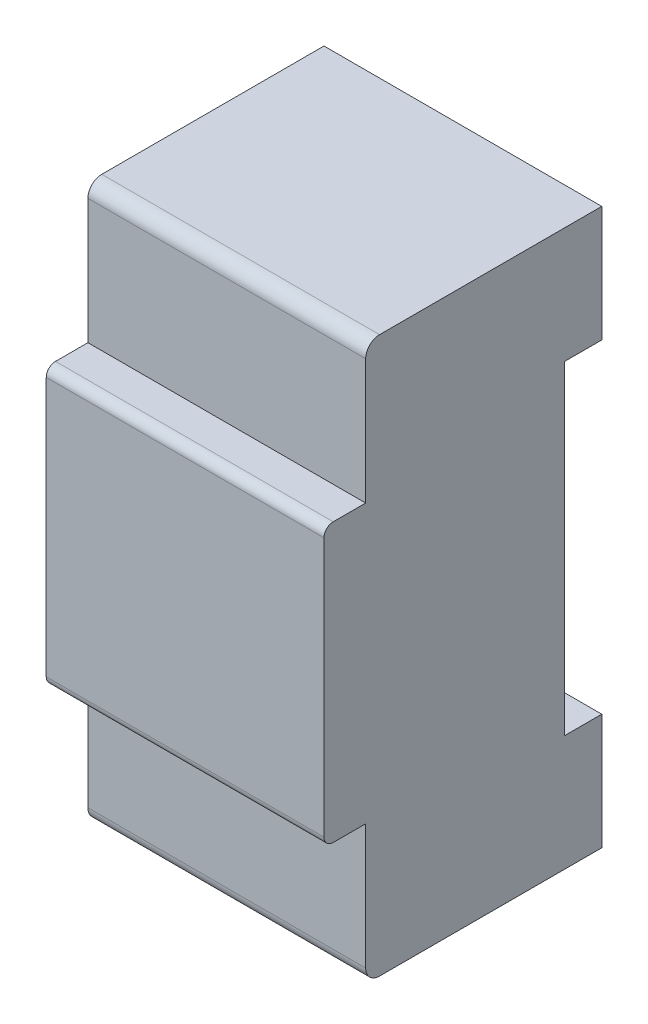
ISO-10303-21;
HEADER;
FILE_DESCRIPTION(('STEP AP214'),'2;1');
FILE_NAME('part.step','',(''),(''),'','','');
FILE_SCHEMA(('AUTOMOTIVE_DESIGN { 1 0 10303 214 1 1 1 1 }'));
ENDSEC;
DATA;
#1=APPLICATION_CONTEXT('core data for automotive mechanical design processes');
#2=APPLICATION_PROTOCOL_DEFINITION('international standard','automotive_design',2000,#1);
#3=PRODUCT_CONTEXT('',#1,'mechanical');
#4=PRODUCT('Part','Part','',(#3));
#5=PRODUCT_RELATED_PRODUCT_CATEGORY('part','',(#4));
#6=PRODUCT_DEFINITION_FORMATION('','',#4);
#7=PRODUCT_DEFINITION_CONTEXT('part definition',#1,'design');
#8=PRODUCT_DEFINITION('design','',#6,#7);
#9=PRODUCT_DEFINITION_SHAPE('','',#8);
#10=(LENGTH_UNIT() NAMED_UNIT(*) SI_UNIT(.MILLI.,.METRE.));
#11=(NAMED_UNIT(*) PLANE_ANGLE_UNIT() SI_UNIT($,.RADIAN.));
#12=(NAMED_UNIT(*) SI_UNIT($,.STERADIAN.) SOLID_ANGLE_UNIT());
#13=UNCERTAINTY_MEASURE_WITH_UNIT(LENGTH_MEASURE(1.E-05),#10,'distance_accuracy_value','');
#14=(GEOMETRIC_REPRESENTATION_CONTEXT(3) GLOBAL_UNCERTAINTY_ASSIGNED_CONTEXT((#13)) GLOBAL_UNIT_ASSIGNED_CONTEXT((#10,
#11,#12)) REPRESENTATION_CONTEXT('',''));
#15=CARTESIAN_POINT('',(0.,0.,0.));
#16=DIRECTION('',(0.,0.,1.));
#17=DIRECTION('',(1.,0.,0.));
#18=AXIS2_PLACEMENT_3D('',#15,#16,#17);
#19=CARTESIAN_POINT('',(30.,-35.,0.));
#20=DIRECTION('',(0.,0.,1.));
#21=DIRECTION('',(1.,0.,0.));
#22=AXIS2_PLACEMENT_3D('',#19,#20,#21);
#23=PLANE('',#22);
#24=DIRECTION('',(0.,1.,0.));
#25=VECTOR('',#24,1.);
#26=CARTESIAN_POINT('',(0.,-35.,0.));
#27=LINE('',#26,#25);
#28=CARTESIAN_POINT('',(0.,-35.,0.));
#29=VERTEX_POINT('',#28);
#30=CARTESIAN_POINT('',(0.,0.,0.));
#31=VERTEX_POINT('',#30);
#32=EDGE_CURVE('E168',#29,#31,#27,.T.);
#33=ORIENTED_EDGE('',*,*,#32,.T.);
#34=DIRECTION('',(-1.,0.,0.));
#35=VECTOR('',#34,1.);
#36=CARTESIAN_POINT('',(30.,0.,0.));
#37=LINE('',#36,#35);
#38=CARTESIAN_POINT('',(30.,0.,0.));
#39=VERTEX_POINT('',#38);
#40=EDGE_CURVE('E149',#39,#31,#37,.T.);
#41=ORIENTED_EDGE('',*,*,#40,.F.);
#42=DIRECTION('',(0.,1.,0.));
#43=VECTOR('',#42,1.);
#44=CARTESIAN_POINT('',(30.,-35.,0.));
#45=LINE('',#44,#43);
#46=CARTESIAN_POINT('',(30.,-35.,0.));
#47=VERTEX_POINT('',#46);
#48=EDGE_CURVE('E156',#47,#39,#45,.T.);
#49=ORIENTED_EDGE('',*,*,#48,.F.);
#50=DIRECTION('',(-1.,0.,0.));
#51=VECTOR('',#50,1.);
#52=CARTESIAN_POINT('',(30.,-35.,0.));
#53=LINE('',#52,#51);
#54=EDGE_CURVE('E244',#47,#29,#53,.T.);
#55=ORIENTED_EDGE('',*,*,#54,.T.);
#56=EDGE_LOOP('',(#33,#41,#49,#55));
#57=FACE_BOUND('',#56,.T.);
#58=ADVANCED_FACE('F30',(#57),#23,.F.);
#59=CARTESIAN_POINT('',(30.,0.,0.));
#60=DIRECTION('',(0.,1.,0.));
#61=DIRECTION('',(0.,0.,1.));
#62=AXIS2_PLACEMENT_3D('',#59,#60,#61);
#63=PLANE('',#62);
#64=DIRECTION('',(0.,0.,-1.));
#65=VECTOR('',#64,1.);
#66=CARTESIAN_POINT('',(0.,0.,0.));
#67=LINE('',#66,#65);
#68=CARTESIAN_POINT('',(0.,0.,-4.));
#69=VERTEX_POINT('',#68);
#70=EDGE_CURVE('E271',#31,#69,#67,.T.);
#71=ORIENTED_EDGE('',*,*,#70,.T.);
#72=DIRECTION('',(-1.,0.,0.));
#73=VECTOR('',#72,1.);
#74=CARTESIAN_POINT('',(30.,0.,-4.));
#75=LINE('',#74,#73);
#76=CARTESIAN_POINT('',(30.,0.,-4.));
#77=VERTEX_POINT('',#76);
#78=EDGE_CURVE('E152',#77,#69,#75,.T.);
#79=ORIENTED_EDGE('',*,*,#78,.F.);
#80=DIRECTION('',(0.,0.,-1.));
#81=VECTOR('',#80,1.);
#82=CARTESIAN_POINT('',(30.,0.,0.));
#83=LINE('',#82,#81);
#84=EDGE_CURVE('E145',#39,#77,#83,.T.);
#85=ORIENTED_EDGE('',*,*,#84,.F.);
#86=ORIENTED_EDGE('',*,*,#40,.T.);
#87=EDGE_LOOP('',(#71,#79,#85,#86));
#88=FACE_BOUND('',#87,.T.);
#89=ADVANCED_FACE('F147',(#88),#63,.F.);
#90=CARTESIAN_POINT('',(30.,0.,-4.));
#91=DIRECTION('',(0.,0.,1.));
#92=DIRECTION('',(1.,0.,0.));
#93=AXIS2_PLACEMENT_3D('',#90,#91,#92);
#94=PLANE('',#93);
#95=DIRECTION('',(0.,1.,0.));
#96=VECTOR('',#95,1.);
#97=CARTESIAN_POINT('',(0.,0.,-4.));
#98=LINE('',#97,#96);
#99=CARTESIAN_POINT('',(0.,12.5,-4.));
#100=VERTEX_POINT('',#99);
#101=EDGE_CURVE('E268',#69,#100,#98,.T.);
#102=ORIENTED_EDGE('',*,*,#101,.T.);
#103=DIRECTION('',(-1.,0.,0.));
#104=VECTOR('',#103,1.);
#105=CARTESIAN_POINT('',(30.,12.5,-4.));
#106=LINE('',#105,#104);
#107=CARTESIAN_POINT('',(30.,12.5,-4.));
#108=VERTEX_POINT('',#107);
#109=EDGE_CURVE('E174',#108,#100,#106,.T.);
#110=ORIENTED_EDGE('',*,*,#109,.F.);
#111=DIRECTION('',(0.,1.,0.));
#112=VECTOR('',#111,1.);
#113=CARTESIAN_POINT('',(30.,0.,-4.));
#114=LINE('',#113,#112);
#115=EDGE_CURVE('E155',#77,#108,#114,.T.);
#116=ORIENTED_EDGE('',*,*,#115,.F.);
#117=ORIENTED_EDGE('',*,*,#78,.T.);
#118=EDGE_LOOP('',(#102,#110,#116,#117));
#119=FACE_BOUND('',#118,.T.);
#120=ADVANCED_FACE('F289',(#119),#94,.F.);
#121=CARTESIAN_POINT('',(30.,12.5,-4.));
#122=DIRECTION('',(0.,-1.,0.));
#123=DIRECTION('',(0.,0.,-1.));
#124=AXIS2_PLACEMENT_3D('',#121,#122,#123);
#125=PLANE('',#124);
#126=DIRECTION('',(0.,0.,1.));
#127=VECTOR('',#126,1.);
#128=CARTESIAN_POINT('',(0.,12.5,-4.));
#129=LINE('',#128,#127);
#130=CARTESIAN_POINT('',(0.,12.5,20.));
#131=VERTEX_POINT('',#130);
#132=EDGE_CURVE('E262',#100,#131,#129,.T.);
#133=ORIENTED_EDGE('',*,*,#132,.T.);
#134=DIRECTION('',(-1.,0.,0.));
#135=VECTOR('',#134,1.);
#136=CARTESIAN_POINT('',(30.,12.5,20.));
#137=LINE('',#136,#135);
#138=CARTESIAN_POINT('',(30.,12.5,20.));
#139=VERTEX_POINT('',#138);
#140=EDGE_CURVE('E190',#131,#139,#137,.F.);
#141=ORIENTED_EDGE('',*,*,#140,.T.);
#142=DIRECTION('',(0.,0.,1.));
#143=VECTOR('',#142,1.);
#144=CARTESIAN_POINT('',(30.,12.5,-4.));
#145=LINE('',#144,#143);
#146=EDGE_CURVE('E265',#108,#139,#145,.T.);
#147=ORIENTED_EDGE('',*,*,#146,.F.);
#148=ORIENTED_EDGE('',*,*,#109,.T.);
#149=EDGE_LOOP('',(#133,#141,#147,#148));
#150=FACE_BOUND('',#149,.T.);
#151=ADVANCED_FACE('F261',(#150),#125,.F.);
#152=CARTESIAN_POINT('',(30.,12.5,21.5));
#153=DIRECTION('',(0.,0.,-1.));
#154=DIRECTION('',(-1.,0.,0.));
#155=AXIS2_PLACEMENT_3D('',#152,#153,#154);
#156=PLANE('',#155);
#157=DIRECTION('',(0.,-1.,0.));
#158=VECTOR('',#157,1.);
#159=CARTESIAN_POINT('',(30.,12.5,21.5));
#160=LINE('',#159,#158);
#161=CARTESIAN_POINT('',(30.,11.,21.5));
#162=VERTEX_POINT('',#161);
#163=CARTESIAN_POINT('',(30.,-2.50000000000001,21.5));
#164=VERTEX_POINT('',#163);
#165=EDGE_CURVE('E285',#162,#164,#160,.T.);
#166=ORIENTED_EDGE('',*,*,#165,.F.);
#167=DIRECTION('',(-1.,0.,0.));
#168=VECTOR('',#167,1.);
#169=CARTESIAN_POINT('',(30.,11.,21.5));
#170=LINE('',#169,#168);
#171=CARTESIAN_POINT('',(0.,11.,21.5));
#172=VERTEX_POINT('',#171);
#173=EDGE_CURVE('E187',#162,#172,#170,.T.);
#174=ORIENTED_EDGE('',*,*,#173,.T.);
#175=DIRECTION('',(0.,-1.,0.));
#176=VECTOR('',#175,1.);
#177=CARTESIAN_POINT('',(0.,12.5,21.5));
#178=LINE('',#177,#176);
#179=CARTESIAN_POINT('',(0.,-2.50000000000001,21.5));
#180=VERTEX_POINT('',#179);
#181=EDGE_CURVE('E233',#172,#180,#178,.T.);
#182=ORIENTED_EDGE('',*,*,#181,.T.);
#183=DIRECTION('',(-1.,0.,0.));
#184=VECTOR('',#183,1.);
#185=CARTESIAN_POINT('',(30.,-2.50000000000001,21.5));
#186=LINE('',#185,#184);
#187=EDGE_CURVE('E253',#164,#180,#186,.T.);
#188=ORIENTED_EDGE('',*,*,#187,.F.);
#189=EDGE_LOOP('',(#166,#174,#182,#188));
#190=FACE_BOUND('',#189,.T.);
#191=ADVANCED_FACE('F296',(#190),#156,.F.);
#192=CARTESIAN_POINT('',(30.,-2.50000000000001,21.5));
#193=DIRECTION('',(0.,-1.,0.));
#194=DIRECTION('',(0.,0.,-1.));
#195=AXIS2_PLACEMENT_3D('',#192,#193,#194);
#196=PLANE('',#195);
#197=DIRECTION('',(0.,0.,1.));
#198=VECTOR('',#197,1.);
#199=CARTESIAN_POINT('',(0.,-2.50000000000001,21.5));
#200=LINE('',#199,#198);
#201=CARTESIAN_POINT('',(0.,-2.5,25.));
#202=VERTEX_POINT('',#201);
#203=EDGE_CURVE('E229',#180,#202,#200,.T.);
#204=ORIENTED_EDGE('',*,*,#203,.T.);
#205=DIRECTION('',(-1.,0.,0.));
#206=VECTOR('',#205,1.);
#207=CARTESIAN_POINT('',(30.,-2.5,25.));
#208=LINE('',#207,#206);
#209=CARTESIAN_POINT('',(30.,-2.5,25.));
#210=VERTEX_POINT('',#209);
#211=EDGE_CURVE('E11',#202,#210,#208,.F.);
#212=ORIENTED_EDGE('',*,*,#211,.T.);
#213=DIRECTION('',(0.,0.,1.));
#214=VECTOR('',#213,1.);
#215=CARTESIAN_POINT('',(30.,-2.50000000000001,21.5));
#216=LINE('',#215,#214);
#217=EDGE_CURVE('E283',#164,#210,#216,.T.);
#218=ORIENTED_EDGE('',*,*,#217,.F.);
#219=ORIENTED_EDGE('',*,*,#187,.T.);
#220=EDGE_LOOP('',(#204,#212,#218,#219));
#221=FACE_BOUND('',#220,.T.);
#222=ADVANCED_FACE('F321',(#221),#196,.F.);
#223=CARTESIAN_POINT('',(30.,-2.5,26.));
#224=DIRECTION('',(0.,0.,-1.));
#225=DIRECTION('',(-1.,0.,0.));
#226=AXIS2_PLACEMENT_3D('',#223,#224,#225);
#227=PLANE('',#226);
#228=DIRECTION('',(0.,-1.,0.));
#229=VECTOR('',#228,1.);
#230=CARTESIAN_POINT('',(0.,-2.5,26.));
#231=LINE('',#230,#229);
#232=CARTESIAN_POINT('',(0.,-3.5,26.));
#233=VERTEX_POINT('',#232);
#234=CARTESIAN_POINT('',(0.,-31.5,26.));
#235=VERTEX_POINT('',#234);
#236=EDGE_CURVE('E224',#233,#235,#231,.T.);
#237=ORIENTED_EDGE('',*,*,#236,.T.);
#238=DIRECTION('',(-1.,0.,0.));
#239=VECTOR('',#238,1.);
#240=CARTESIAN_POINT('',(30.,-31.5,26.));
#241=LINE('',#240,#239);
#242=CARTESIAN_POINT('',(30.,-31.5,26.));
#243=VERTEX_POINT('',#242);
#244=EDGE_CURVE('E51',#235,#243,#241,.F.);
#245=ORIENTED_EDGE('',*,*,#244,.T.);
#246=DIRECTION('',(0.,-1.,0.));
#247=VECTOR('',#246,1.);
#248=CARTESIAN_POINT('',(30.,-2.5,26.));
#249=LINE('',#248,#247);
#250=CARTESIAN_POINT('',(30.,-3.5,26.));
#251=VERTEX_POINT('',#250);
#252=EDGE_CURVE('E209',#251,#243,#249,.T.);
#253=ORIENTED_EDGE('',*,*,#252,.F.);
#254=DIRECTION('',(-1.,0.,0.));
#255=VECTOR('',#254,1.);
#256=CARTESIAN_POINT('',(30.,-3.5,26.));
#257=LINE('',#256,#255);
#258=EDGE_CURVE('E199',#251,#233,#257,.T.);
#259=ORIENTED_EDGE('',*,*,#258,.T.);
#260=EDGE_LOOP('',(#237,#245,#253,#259));
#261=FACE_BOUND('',#260,.T.);
#262=ADVANCED_FACE('F227',(#261),#227,.F.);
#263=CARTESIAN_POINT('',(30.,-32.5,26.));
#264=DIRECTION('',(0.,1.,0.));
#265=DIRECTION('',(0.,0.,1.));
#266=AXIS2_PLACEMENT_3D('',#263,#264,#265);
#267=PLANE('',#266);
#268=DIRECTION('',(0.,0.,-1.));
#269=VECTOR('',#268,1.);
#270=CARTESIAN_POINT('',(30.,-32.5,26.));
#271=LINE('',#270,#269);
#272=CARTESIAN_POINT('',(30.,-32.5,25.));
#273=VERTEX_POINT('',#272);
#274=CARTESIAN_POINT('',(30.,-32.5,21.5));
#275=VERTEX_POINT('',#274);
#276=EDGE_CURVE('E207',#273,#275,#271,.T.);
#277=ORIENTED_EDGE('',*,*,#276,.F.);
#278=DIRECTION('',(-1.,0.,0.));
#279=VECTOR('',#278,1.);
#280=CARTESIAN_POINT('',(30.,-32.5,25.));
#281=LINE('',#280,#279);
#282=CARTESIAN_POINT('',(0.,-32.5,25.));
#283=VERTEX_POINT('',#282);
#284=EDGE_CURVE('E192',#273,#283,#281,.T.);
#285=ORIENTED_EDGE('',*,*,#284,.T.);
#286=DIRECTION('',(0.,0.,-1.));
#287=VECTOR('',#286,1.);
#288=CARTESIAN_POINT('',(0.,-32.5,26.));
#289=LINE('',#288,#287);
#290=CARTESIAN_POINT('',(0.,-32.5,21.5));
#291=VERTEX_POINT('',#290);
#292=EDGE_CURVE('E226',#283,#291,#289,.T.);
#293=ORIENTED_EDGE('',*,*,#292,.T.);
#294=DIRECTION('',(-1.,0.,0.));
#295=VECTOR('',#294,1.);
#296=CARTESIAN_POINT('',(30.,-32.5,21.5));
#297=LINE('',#296,#295);
#298=EDGE_CURVE('E216',#275,#291,#297,.T.);
#299=ORIENTED_EDGE('',*,*,#298,.F.);
#300=EDGE_LOOP('',(#277,#285,#293,#299));
#301=FACE_BOUND('',#300,.T.);
#302=ADVANCED_FACE('F213',(#301),#267,.F.);
#303=CARTESIAN_POINT('',(30.,-32.5,21.5));
#304=DIRECTION('',(0.,0.,-1.));
#305=DIRECTION('',(-1.,0.,0.));
#306=AXIS2_PLACEMENT_3D('',#303,#304,#305);
#307=PLANE('',#306);
#308=DIRECTION('',(0.,-1.,0.));
#309=VECTOR('',#308,1.);
#310=CARTESIAN_POINT('',(0.,-32.5,21.5));
#311=LINE('',#310,#309);
#312=CARTESIAN_POINT('',(0.,-46.,21.5));
#313=VERTEX_POINT('',#312);
#314=EDGE_CURVE('E231',#291,#313,#311,.T.);
#315=ORIENTED_EDGE('',*,*,#314,.T.);
#316=DIRECTION('',(-1.,0.,0.));
#317=VECTOR('',#316,1.);
#318=CARTESIAN_POINT('',(30.,-46.,21.5));
#319=LINE('',#318,#317);
#320=CARTESIAN_POINT('',(30.,-46.,21.5));
#321=VERTEX_POINT('',#320);
#322=EDGE_CURVE('E181',#313,#321,#319,.F.);
#323=ORIENTED_EDGE('',*,*,#322,.T.);
#324=DIRECTION('',(0.,-1.,0.));
#325=VECTOR('',#324,1.);
#326=CARTESIAN_POINT('',(30.,-32.5,21.5));
#327=LINE('',#326,#325);
#328=EDGE_CURVE('E218',#275,#321,#327,.T.);
#329=ORIENTED_EDGE('',*,*,#328,.F.);
#330=ORIENTED_EDGE('',*,*,#298,.T.);
#331=EDGE_LOOP('',(#315,#323,#329,#330));
#332=FACE_BOUND('',#331,.T.);
#333=ADVANCED_FACE('F336',(#332),#307,.F.);
#334=CARTESIAN_POINT('',(30.,-47.5,21.5));
#335=DIRECTION('',(0.,1.,0.));
#336=DIRECTION('',(0.,0.,1.));
#337=AXIS2_PLACEMENT_3D('',#334,#335,#336);
#338=PLANE('',#337);
#339=DIRECTION('',(0.,0.,-1.));
#340=VECTOR('',#339,1.);
#341=CARTESIAN_POINT('',(30.,-47.5,21.5));
#342=LINE('',#341,#340);
#343=CARTESIAN_POINT('',(30.,-47.5,20.));
#344=VERTEX_POINT('',#343);
#345=CARTESIAN_POINT('',(30.,-47.5,-4.));
#346=VERTEX_POINT('',#345);
#347=EDGE_CURVE('E279',#344,#346,#342,.T.);
#348=ORIENTED_EDGE('',*,*,#347,.F.);
#349=DIRECTION('',(-1.,0.,0.));
#350=VECTOR('',#349,1.);
#351=CARTESIAN_POINT('',(30.,-47.5,20.));
#352=LINE('',#351,#350);
#353=CARTESIAN_POINT('',(0.,-47.5,20.));
#354=VERTEX_POINT('',#353);
#355=EDGE_CURVE('E169',#344,#354,#352,.T.);
#356=ORIENTED_EDGE('',*,*,#355,.T.);
#357=DIRECTION('',(0.,0.,-1.));
#358=VECTOR('',#357,1.);
#359=CARTESIAN_POINT('',(0.,-47.5,21.5));
#360=LINE('',#359,#358);
#361=CARTESIAN_POINT('',(0.,-47.5,-4.));
#362=VERTEX_POINT('',#361);
#363=EDGE_CURVE('E239',#354,#362,#360,.T.);
#364=ORIENTED_EDGE('',*,*,#363,.T.);
#365=DIRECTION('',(-1.,0.,0.));
#366=VECTOR('',#365,1.);
#367=CARTESIAN_POINT('',(30.,-47.5,-4.));
#368=LINE('',#367,#366);
#369=EDGE_CURVE('E249',#346,#362,#368,.T.);
#370=ORIENTED_EDGE('',*,*,#369,.F.);
#371=EDGE_LOOP('',(#348,#356,#364,#370));
#372=FACE_BOUND('',#371,.T.);
#373=ADVANCED_FACE('F339',(#372),#338,.F.);
#374=CARTESIAN_POINT('',(30.,-47.5,-4.));
#375=DIRECTION('',(0.,0.,1.));
#376=DIRECTION('',(1.,0.,0.));
#377=AXIS2_PLACEMENT_3D('',#374,#375,#376);
#378=PLANE('',#377);
#379=DIRECTION('',(0.,1.,0.));
#380=VECTOR('',#379,1.);
#381=CARTESIAN_POINT('',(0.,-47.5,-4.));
#382=LINE('',#381,#380);
#383=CARTESIAN_POINT('',(0.,-35.,-4.));
#384=VERTEX_POINT('',#383);
#385=EDGE_CURVE('E241',#362,#384,#382,.T.);
#386=ORIENTED_EDGE('',*,*,#385,.T.);
#387=DIRECTION('',(-1.,0.,0.));
#388=VECTOR('',#387,1.);
#389=CARTESIAN_POINT('',(30.,-35.,-4.));
#390=LINE('',#389,#388);
#391=CARTESIAN_POINT('',(30.,-35.,-4.));
#392=VERTEX_POINT('',#391);
#393=EDGE_CURVE('E246',#392,#384,#390,.T.);
#394=ORIENTED_EDGE('',*,*,#393,.F.);
#395=DIRECTION('',(0.,1.,0.));
#396=VECTOR('',#395,1.);
#397=CARTESIAN_POINT('',(30.,-47.5,-4.));
#398=LINE('',#397,#396);
#399=EDGE_CURVE('E277',#346,#392,#398,.T.);
#400=ORIENTED_EDGE('',*,*,#399,.F.);
#401=ORIENTED_EDGE('',*,*,#369,.T.);
#402=EDGE_LOOP('',(#386,#394,#400,#401));
#403=FACE_BOUND('',#402,.T.);
#404=ADVANCED_FACE('F343',(#403),#378,.F.);
#405=CARTESIAN_POINT('',(30.,-35.,-4.));
#406=DIRECTION('',(0.,-1.,0.));
#407=DIRECTION('',(0.,0.,-1.));
#408=AXIS2_PLACEMENT_3D('',#405,#406,#407);
#409=PLANE('',#408);
#410=DIRECTION('',(0.,0.,1.));
#411=VECTOR('',#410,1.);
#412=CARTESIAN_POINT('',(0.,-35.,-4.));
#413=LINE('',#412,#411);
#414=EDGE_CURVE('E165',#384,#29,#413,.T.);
#415=ORIENTED_EDGE('',*,*,#414,.T.);
#416=ORIENTED_EDGE('',*,*,#54,.F.);
#417=DIRECTION('',(0.,0.,1.));
#418=VECTOR('',#417,1.);
#419=CARTESIAN_POINT('',(30.,-35.,-4.));
#420=LINE('',#419,#418);
#421=EDGE_CURVE('E161',#392,#47,#420,.T.);
#422=ORIENTED_EDGE('',*,*,#421,.F.);
#423=ORIENTED_EDGE('',*,*,#393,.T.);
#424=EDGE_LOOP('',(#415,#416,#422,#423));
#425=FACE_BOUND('',#424,.T.);
#426=ADVANCED_FACE('F347',(#425),#409,.F.);
#427=CARTESIAN_POINT('',(30.,0.,0.));
#428=DIRECTION('',(-1.,0.,0.));
#429=DIRECTION('',(0.,0.,1.));
#430=AXIS2_PLACEMENT_3D('',#427,#428,#429);
#431=PLANE('',#430);
#432=ORIENTED_EDGE('',*,*,#252,.T.);
#433=CARTESIAN_POINT('',(30.,-31.5,25.));
#434=DIRECTION('',(-1.,0.,0.));
#435=DIRECTION('',(0.,0.,1.));
#436=AXIS2_PLACEMENT_3D('',#433,#434,#435);
#437=CIRCLE('',#436,1.);
#438=EDGE_CURVE('E38',#243,#273,#437,.F.);
#439=ORIENTED_EDGE('',*,*,#438,.T.);
#440=ORIENTED_EDGE('',*,*,#276,.T.);
#441=ORIENTED_EDGE('',*,*,#328,.T.);
#442=CARTESIAN_POINT('',(30.,-46.,20.));
#443=DIRECTION('',(-1.,0.,0.));
#444=DIRECTION('',(0.,0.,1.));
#445=AXIS2_PLACEMENT_3D('',#442,#443,#444);
#446=CIRCLE('',#445,1.5);
#447=EDGE_CURVE('E185',#321,#344,#446,.F.);
#448=ORIENTED_EDGE('',*,*,#447,.T.);
#449=ORIENTED_EDGE('',*,*,#347,.T.);
#450=ORIENTED_EDGE('',*,*,#399,.T.);
#451=ORIENTED_EDGE('',*,*,#421,.T.);
#452=ORIENTED_EDGE('',*,*,#48,.T.);
#453=ORIENTED_EDGE('',*,*,#84,.T.);
#454=ORIENTED_EDGE('',*,*,#115,.T.);
#455=ORIENTED_EDGE('',*,*,#146,.T.);
#456=CARTESIAN_POINT('',(30.,11.,20.));
#457=DIRECTION('',(-1.,0.,0.));
#458=DIRECTION('',(0.,0.,1.));
#459=AXIS2_PLACEMENT_3D('',#456,#457,#458);
#460=CIRCLE('',#459,1.5);
#461=EDGE_CURVE('E183',#139,#162,#460,.F.);
#462=ORIENTED_EDGE('',*,*,#461,.T.);
#463=ORIENTED_EDGE('',*,*,#165,.T.);
#464=ORIENTED_EDGE('',*,*,#217,.T.);
#465=CARTESIAN_POINT('',(30.,-3.5,25.));
#466=DIRECTION('',(-1.,0.,0.));
#467=DIRECTION('',(0.,0.,1.));
#468=AXIS2_PLACEMENT_3D('',#465,#466,#467);
#469=CIRCLE('',#468,1.);
#470=EDGE_CURVE('E203',#210,#251,#469,.F.);
#471=ORIENTED_EDGE('',*,*,#470,.T.);
#472=EDGE_LOOP('',(#432,#439,#440,#441,#448,#449,#450,#451,#452,#453,#454,#455,#462,#463,#464,#471));
#473=FACE_BOUND('',#472,.T.);
#474=ADVANCED_FACE('F159',(#473),#431,.F.);
#475=CARTESIAN_POINT('',(0.,0.,0.));
#476=DIRECTION('',(-1.,0.,0.));
#477=DIRECTION('',(0.,0.,1.));
#478=AXIS2_PLACEMENT_3D('',#475,#476,#477);
#479=PLANE('',#478);
#480=ORIENTED_EDGE('',*,*,#292,.F.);
#481=CARTESIAN_POINT('',(0.,-31.5,25.));
#482=DIRECTION('',(-1.,0.,0.));
#483=DIRECTION('',(0.,0.,1.));
#484=AXIS2_PLACEMENT_3D('',#481,#482,#483);
#485=CIRCLE('',#484,1.);
#486=EDGE_CURVE('E197',#283,#235,#485,.T.);
#487=ORIENTED_EDGE('',*,*,#486,.T.);
#488=ORIENTED_EDGE('',*,*,#236,.F.);
#489=CARTESIAN_POINT('',(0.,-3.5,25.));
#490=DIRECTION('',(-1.,0.,0.));
#491=DIRECTION('',(0.,0.,1.));
#492=AXIS2_PLACEMENT_3D('',#489,#490,#491);
#493=CIRCLE('',#492,1.);
#494=EDGE_CURVE('E195',#233,#202,#493,.T.);
#495=ORIENTED_EDGE('',*,*,#494,.T.);
#496=ORIENTED_EDGE('',*,*,#203,.F.);
#497=ORIENTED_EDGE('',*,*,#181,.F.);
#498=CARTESIAN_POINT('',(0.,11.,20.));
#499=DIRECTION('',(-1.,0.,0.));
#500=DIRECTION('',(0.,0.,1.));
#501=AXIS2_PLACEMENT_3D('',#498,#499,#500);
#502=CIRCLE('',#501,1.5);
#503=EDGE_CURVE('E172',#172,#131,#502,.T.);
#504=ORIENTED_EDGE('',*,*,#503,.T.);
#505=ORIENTED_EDGE('',*,*,#132,.F.);
#506=ORIENTED_EDGE('',*,*,#101,.F.);
#507=ORIENTED_EDGE('',*,*,#70,.F.);
#508=ORIENTED_EDGE('',*,*,#32,.F.);
#509=ORIENTED_EDGE('',*,*,#414,.F.);
#510=ORIENTED_EDGE('',*,*,#385,.F.);
#511=ORIENTED_EDGE('',*,*,#363,.F.);
#512=CARTESIAN_POINT('',(0.,-46.,20.));
#513=DIRECTION('',(-1.,0.,0.));
#514=DIRECTION('',(0.,0.,1.));
#515=AXIS2_PLACEMENT_3D('',#512,#513,#514);
#516=CIRCLE('',#515,1.5);
#517=EDGE_CURVE('E179',#354,#313,#516,.T.);
#518=ORIENTED_EDGE('',*,*,#517,.T.);
#519=ORIENTED_EDGE('',*,*,#314,.F.);
#520=EDGE_LOOP('',(#480,#487,#488,#495,#496,#497,#504,#505,#506,#507,#508,#509,#510,#511,#518,#519));
#521=FACE_BOUND('',#520,.T.);
#522=ADVANCED_FACE('F223',(#521),#479,.T.);
#523=CARTESIAN_POINT('',(30.,-46.,20.));
#524=DIRECTION('',(-1.,0.,0.));
#525=DIRECTION('',(0.,0.,1.));
#526=AXIS2_PLACEMENT_3D('',#523,#524,#525);
#527=CYLINDRICAL_SURFACE('',#526,1.5);
#528=ORIENTED_EDGE('',*,*,#447,.F.);
#529=ORIENTED_EDGE('',*,*,#322,.F.);
#530=ORIENTED_EDGE('',*,*,#517,.F.);
#531=ORIENTED_EDGE('',*,*,#355,.F.);
#532=EDGE_LOOP('',(#528,#529,#530,#531));
#533=FACE_BOUND('',#532,.T.);
#534=ADVANCED_FACE('F304',(#533),#527,.T.);
#535=CARTESIAN_POINT('',(30.,11.,20.));
#536=DIRECTION('',(-1.,0.,0.));
#537=DIRECTION('',(0.,0.,1.));
#538=AXIS2_PLACEMENT_3D('',#535,#536,#537);
#539=CYLINDRICAL_SURFACE('',#538,1.5);
#540=ORIENTED_EDGE('',*,*,#461,.F.);
#541=ORIENTED_EDGE('',*,*,#140,.F.);
#542=ORIENTED_EDGE('',*,*,#503,.F.);
#543=ORIENTED_EDGE('',*,*,#173,.F.);
#544=EDGE_LOOP('',(#540,#541,#542,#543));
#545=FACE_BOUND('',#544,.T.);
#546=ADVANCED_FACE('F307',(#545),#539,.T.);
#547=CARTESIAN_POINT('',(30.,-31.5,25.));
#548=DIRECTION('',(-1.,0.,0.));
#549=DIRECTION('',(0.,0.,1.));
#550=AXIS2_PLACEMENT_3D('',#547,#548,#549);
#551=CYLINDRICAL_SURFACE('',#550,1.);
#552=ORIENTED_EDGE('',*,*,#438,.F.);
#553=ORIENTED_EDGE('',*,*,#244,.F.);
#554=ORIENTED_EDGE('',*,*,#486,.F.);
#555=ORIENTED_EDGE('',*,*,#284,.F.);
#556=EDGE_LOOP('',(#552,#553,#554,#555));
#557=FACE_BOUND('',#556,.T.);
#558=ADVANCED_FACE('F220',(#557),#551,.T.);
#559=CARTESIAN_POINT('',(30.,-3.5,25.));
#560=DIRECTION('',(-1.,0.,0.));
#561=DIRECTION('',(0.,0.,1.));
#562=AXIS2_PLACEMENT_3D('',#559,#560,#561);
#563=CYLINDRICAL_SURFACE('',#562,1.);
#564=ORIENTED_EDGE('',*,*,#470,.F.);
#565=ORIENTED_EDGE('',*,*,#211,.F.);
#566=ORIENTED_EDGE('',*,*,#494,.F.);
#567=ORIENTED_EDGE('',*,*,#258,.F.);
#568=EDGE_LOOP('',(#564,#565,#566,#567));
#569=FACE_BOUND('',#568,.T.);
#570=ADVANCED_FACE('F32',(#569),#563,.T.);
#571=CLOSED_SHELL('',(#58,#89,#120,#151,#191,#222,#262,#302,#333,#373,#404,#426,#474,#522,#534,
#546,#558,#570));
#572=MANIFOLD_SOLID_BREP('B2',#571);
#573=ADVANCED_BREP_SHAPE_REPRESENTATION('',(#18,#572),#14);
#574=SHAPE_DEFINITION_REPRESENTATION(#9,#573);
ENDSEC;
END-ISO-10303-21;
